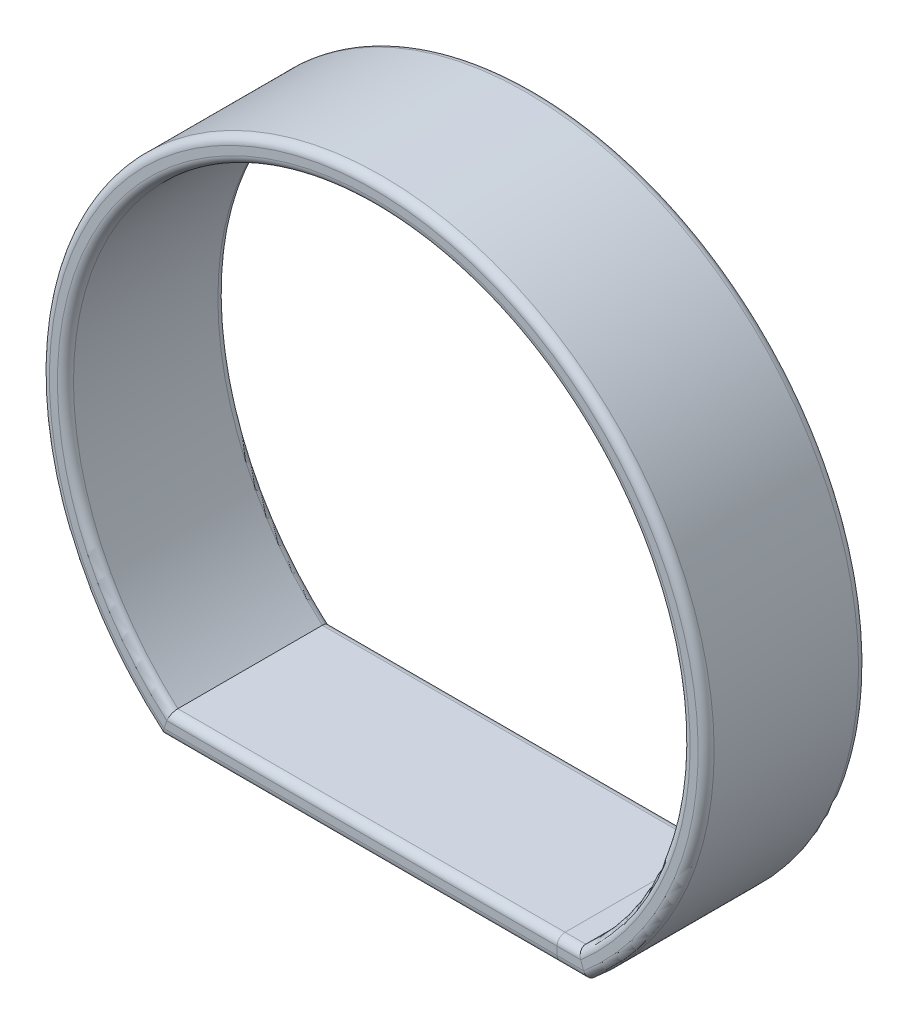
ISO-10303-21;
HEADER;
FILE_DESCRIPTION(('STEP AP214'),'2;1');
FILE_NAME('part.step','',(''),(''),'','','');
FILE_SCHEMA(('AUTOMOTIVE_DESIGN { 1 0 10303 214 1 1 1 1 }'));
ENDSEC;
DATA;
#1=APPLICATION_CONTEXT('core data for automotive mechanical design processes');
#2=APPLICATION_PROTOCOL_DEFINITION('international standard','automotive_design',2000,#1);
#3=PRODUCT_CONTEXT('',#1,'mechanical');
#4=PRODUCT('Part','Part','',(#3));
#5=PRODUCT_RELATED_PRODUCT_CATEGORY('part','',(#4));
#6=PRODUCT_DEFINITION_FORMATION('','',#4);
#7=PRODUCT_DEFINITION_CONTEXT('part definition',#1,'design');
#8=PRODUCT_DEFINITION('design','',#6,#7);
#9=PRODUCT_DEFINITION_SHAPE('','',#8);
#10=(LENGTH_UNIT() NAMED_UNIT(*) SI_UNIT(.MILLI.,.METRE.));
#11=(NAMED_UNIT(*) PLANE_ANGLE_UNIT() SI_UNIT($,.RADIAN.));
#12=(NAMED_UNIT(*) SI_UNIT($,.STERADIAN.) SOLID_ANGLE_UNIT());
#13=UNCERTAINTY_MEASURE_WITH_UNIT(LENGTH_MEASURE(1.E-05),#10,'distance_accuracy_value','');
#14=(GEOMETRIC_REPRESENTATION_CONTEXT(3) GLOBAL_UNCERTAINTY_ASSIGNED_CONTEXT((#13)) GLOBAL_UNIT_ASSIGNED_CONTEXT((#10,
#11,#12)) REPRESENTATION_CONTEXT('',''));
#15=CARTESIAN_POINT('',(0.,0.,0.));
#16=DIRECTION('',(0.,0.,1.));
#17=DIRECTION('',(1.,0.,0.));
#18=AXIS2_PLACEMENT_3D('',#15,#16,#17);
#19=CARTESIAN_POINT('',(-45.9079817895465,4.96898792112468,10.));
#20=DIRECTION('',(0.,0.,-1.));
#21=DIRECTION('',(-1.,0.,0.));
#22=AXIS2_PLACEMENT_3D('',#19,#20,#21);
#23=PLANE('',#22);
#24=CARTESIAN_POINT('',(0.,-3.42686325526142,10.));
#25=DIRECTION('',(0.,1.,0.));
#26=VECTOR('',#25,1.);
#27=LINE('',#24,#26);
#28=CARTESIAN_POINT('',(0.,-3.42686325526142,10.));
#29=VERTEX_POINT('',#28);
#30=CARTESIAN_POINT('',(0.,-2.42686325526142,10.));
#31=VERTEX_POINT('',#30);
#32=EDGE_CURVE('E198',#29,#31,#27,.T.);
#33=ORIENTED_EDGE('',*,*,#32,.T.);
#34=DIRECTION('',(1.,0.,0.));
#35=VECTOR('',#34,1.);
#36=CARTESIAN_POINT('',(-45.9079817895465,-2.42686325526143,10.));
#37=LINE('',#36,#35);
#38=CARTESIAN_POINT('',(-48.6453493144092,-2.42686325526143,10.));
#39=VERTEX_POINT('',#38);
#40=EDGE_CURVE('E162',#31,#39,#37,.F.);
#41=ORIENTED_EDGE('',*,*,#40,.T.);
#42=CARTESIAN_POINT('',(-22.8511839422926,27.3973683071413,10.));
#43=DIRECTION('',(0.,0.,1.));
#44=DIRECTION('',(1.,0.,0.));
#45=AXIS2_PLACEMENT_3D('',#42,#43,#44);
#46=CIRCLE('',#45,39.4312554041002);
#47=CARTESIAN_POINT('',(-48.6409213207164,-2.4306947995258,10.));
#48=VERTEX_POINT('',#47);
#49=EDGE_CURVE('E48',#39,#48,#46,.T.);
#50=ORIENTED_EDGE('',*,*,#49,.T.);
#51=DIRECTION('',(0.346457639778276,0.938065618088237,0.));
#52=VECTOR('',#51,1.);
#53=CARTESIAN_POINT('',(-45.9079817895465,4.96898792112468,10.));
#54=LINE('',#53,#52);
#55=CARTESIAN_POINT('',(-49.0088381970422,-3.42686325526143,10.));
#56=VERTEX_POINT('',#55);
#57=EDGE_CURVE('E501',#56,#48,#54,.T.);
#58=ORIENTED_EDGE('',*,*,#57,.F.);
#59=DIRECTION('',(1.,0.,0.));
#60=VECTOR('',#59,1.);
#61=CARTESIAN_POINT('',(-45.9079817895465,-3.42686325526143,10.));
#62=LINE('',#61,#60);
#63=EDGE_CURVE('E191',#56,#29,#62,.T.);
#64=ORIENTED_EDGE('',*,*,#63,.T.);
#65=EDGE_LOOP('',(#33,#41,#50,#58,#64));
#66=FACE_BOUND('',#65,.T.);
#67=ADVANCED_FACE('F37',(#66),#23,.F.);
#68=CARTESIAN_POINT('',(-48.2701742206685,-1.42686325526143,0.));
#69=DIRECTION('',(0.,-1.,0.));
#70=DIRECTION('',(0.,0.,-1.));
#71=AXIS2_PLACEMENT_3D('',#68,#69,#70);
#72=PLANE('',#71);
#73=DIRECTION('',(0.,0.,1.));
#74=VECTOR('',#73,1.);
#75=CARTESIAN_POINT('',(-48.2701742206685,-1.42686325526143,0.));
#76=LINE('',#75,#74);
#77=CARTESIAN_POINT('',(-48.2701742206685,-1.42686325526143,9.));
#78=VERTEX_POINT('',#77);
#79=CARTESIAN_POINT('',(-48.2701742206685,-1.42686325526143,-9.));
#80=VERTEX_POINT('',#79);
#81=EDGE_CURVE('E189',#78,#80,#76,.F.);
#82=ORIENTED_EDGE('',*,*,#81,.F.);
#83=DIRECTION('',(1.,0.,0.));
#84=VECTOR('',#83,1.);
#85=CARTESIAN_POINT('',(-48.2701742206685,-1.42686325526143,9.));
#86=LINE('',#85,#84);
#87=CARTESIAN_POINT('',(0.,-1.42686325526143,9.00000000000001));
#88=VERTEX_POINT('',#87);
#89=EDGE_CURVE('E160',#78,#88,#86,.T.);
#90=ORIENTED_EDGE('',*,*,#89,.T.);
#91=CARTESIAN_POINT('',(0.,-1.42686325526143,9.00000000000001));
#92=DIRECTION('',(0.,0.,-1.));
#93=VECTOR('',#92,1.);
#94=LINE('',#91,#93);
#95=CARTESIAN_POINT('',(0.,-1.42686325526143,-9.00000000000001));
#96=VERTEX_POINT('',#95);
#97=EDGE_CURVE('E186',#88,#96,#94,.T.);
#98=ORIENTED_EDGE('',*,*,#97,.T.);
#99=DIRECTION('',(1.,0.,0.));
#100=VECTOR('',#99,1.);
#101=CARTESIAN_POINT('',(-48.2701742206685,-1.42686325526143,-9.));
#102=LINE('',#101,#100);
#103=EDGE_CURVE('E192',#96,#80,#102,.F.);
#104=ORIENTED_EDGE('',*,*,#103,.T.);
#105=EDGE_LOOP('',(#82,#90,#98,#104));
#106=FACE_BOUND('',#105,.T.);
#107=ADVANCED_FACE('F185',(#106),#72,.F.);
#108=CARTESIAN_POINT('',(-45.9079817895465,4.96898792112468,-10.));
#109=DIRECTION('',(0.,0.,1.));
#110=DIRECTION('',(1.,0.,0.));
#111=AXIS2_PLACEMENT_3D('',#108,#109,#110);
#112=PLANE('',#111);
#113=CARTESIAN_POINT('',(0.,-2.42686325526143,-10.));
#114=DIRECTION('',(0.,-1.,0.));
#115=VECTOR('',#114,1.);
#116=LINE('',#113,#115);
#117=CARTESIAN_POINT('',(0.,-2.42686325526143,-10.));
#118=VERTEX_POINT('',#117);
#119=CARTESIAN_POINT('',(0.,-3.42686325526143,-10.));
#120=VERTEX_POINT('',#119);
#121=EDGE_CURVE('E199',#118,#120,#116,.T.);
#122=ORIENTED_EDGE('',*,*,#121,.T.);
#123=DIRECTION('',(1.,0.,0.));
#124=VECTOR('',#123,1.);
#125=CARTESIAN_POINT('',(-45.9079817895465,-3.42686325526143,-10.));
#126=LINE('',#125,#124);
#127=CARTESIAN_POINT('',(-49.0088381970422,-3.42686325526143,-10.));
#128=VERTEX_POINT('',#127);
#129=EDGE_CURVE('E473',#120,#128,#126,.F.);
#130=ORIENTED_EDGE('',*,*,#129,.T.);
#131=DIRECTION('',(-0.346457639778276,-0.938065618088237,0.));
#132=VECTOR('',#131,1.);
#133=CARTESIAN_POINT('',(-45.9079817895465,4.96898792112468,-10.));
#134=LINE('',#133,#132);
#135=CARTESIAN_POINT('',(-48.6409213207164,-2.43069479952581,-10.));
#136=VERTEX_POINT('',#135);
#137=EDGE_CURVE('E530',#136,#128,#134,.T.);
#138=ORIENTED_EDGE('',*,*,#137,.F.);
#139=CARTESIAN_POINT('',(-22.8511839422926,27.3973683071413,-10.));
#140=DIRECTION('',(0.,0.,-1.));
#141=DIRECTION('',(-1.,0.,0.));
#142=AXIS2_PLACEMENT_3D('',#139,#140,#141);
#143=CIRCLE('',#142,39.4312554041002);
#144=CARTESIAN_POINT('',(-48.6453493144092,-2.42686325526143,-10.));
#145=VERTEX_POINT('',#144);
#146=EDGE_CURVE('E556',#136,#145,#143,.T.);
#147=ORIENTED_EDGE('',*,*,#146,.T.);
#148=DIRECTION('',(1.,0.,0.));
#149=VECTOR('',#148,1.);
#150=CARTESIAN_POINT('',(-45.9079817895465,-2.42686325526143,-10.));
#151=LINE('',#150,#149);
#152=EDGE_CURVE('E533',#145,#118,#151,.T.);
#153=ORIENTED_EDGE('',*,*,#152,.T.);
#154=EDGE_LOOP('',(#122,#130,#138,#147,#153));
#155=FACE_BOUND('',#154,.T.);
#156=ADVANCED_FACE('F307',(#155),#112,.F.);
#157=CARTESIAN_POINT('',(-49.3781701852291,-4.42686325526143,0.));
#158=DIRECTION('',(0.,1.,0.));
#159=DIRECTION('',(0.,0.,1.));
#160=AXIS2_PLACEMENT_3D('',#157,#158,#159);
#161=PLANE('',#160);
#162=CARTESIAN_POINT('',(0.,-4.42686325526143,-9.));
#163=DIRECTION('',(0.,0.,1.));
#164=VECTOR('',#163,1.);
#165=LINE('',#162,#164);
#166=CARTESIAN_POINT('',(0.,-4.42686325526143,-9.));
#167=VERTEX_POINT('',#166);
#168=CARTESIAN_POINT('',(0.,-4.42686325526143,9.));
#169=VERTEX_POINT('',#168);
#170=EDGE_CURVE('E249',#167,#169,#165,.T.);
#171=ORIENTED_EDGE('',*,*,#170,.T.);
#172=DIRECTION('',(1.,0.,0.));
#173=VECTOR('',#172,1.);
#174=CARTESIAN_POINT('',(-49.3781701852291,-4.42686325526143,9.));
#175=LINE('',#174,#173);
#176=CARTESIAN_POINT('',(-49.3781701852291,-4.42686325526143,9.));
#177=VERTEX_POINT('',#176);
#178=EDGE_CURVE('E255',#169,#177,#175,.F.);
#179=ORIENTED_EDGE('',*,*,#178,.T.);
#180=DIRECTION('',(0.,0.,1.));
#181=VECTOR('',#180,1.);
#182=CARTESIAN_POINT('',(-49.3781701852291,-4.42686325526143,0.));
#183=LINE('',#182,#181);
#184=CARTESIAN_POINT('',(-49.3781701852291,-4.42686325526143,-9.));
#185=VERTEX_POINT('',#184);
#186=EDGE_CURVE('E742',#185,#177,#183,.T.);
#187=ORIENTED_EDGE('',*,*,#186,.F.);
#188=DIRECTION('',(1.,0.,0.));
#189=VECTOR('',#188,1.);
#190=CARTESIAN_POINT('',(-49.3781701852291,-4.42686325526143,-9.));
#191=LINE('',#190,#189);
#192=EDGE_CURVE('E253',#185,#167,#191,.T.);
#193=ORIENTED_EDGE('',*,*,#192,.T.);
#194=EDGE_LOOP('',(#171,#179,#187,#193));
#195=FACE_BOUND('',#194,.T.);
#196=ADVANCED_FACE('F315',(#195),#161,.F.);
#197=CARTESIAN_POINT('',(-22.8511839422926,27.3973683071413,0.));
#198=DIRECTION('',(0.,0.,1.));
#199=DIRECTION('',(1.,0.,0.));
#200=AXIS2_PLACEMENT_3D('',#197,#198,#199);
#201=CYLINDRICAL_SURFACE('',#200,38.4312554041002);
#202=ORIENTED_EDGE('',*,*,#81,.T.);
#203=CARTESIAN_POINT('',(-22.8511839422926,27.3973683071413,-9.));
#204=DIRECTION('',(0.,0.,-1.));
#205=DIRECTION('',(-1.,0.,0.));
#206=AXIS2_PLACEMENT_3D('',#203,#204,#205);
#207=CIRCLE('',#206,38.4312554041002);
#208=CARTESIAN_POINT('',(2.56780633608324,-1.42686325526142,-9.));
#209=VERTEX_POINT('',#208);
#210=EDGE_CURVE('E527',#80,#209,#207,.T.);
#211=ORIENTED_EDGE('',*,*,#210,.T.);
#212=DIRECTION('',(0.,0.,1.));
#213=VECTOR('',#212,1.);
#214=CARTESIAN_POINT('',(2.56780633608324,-1.42686325526142,10.));
#215=LINE('',#214,#213);
#216=CARTESIAN_POINT('',(2.56780633608324,-1.42686325526142,9.));
#217=VERTEX_POINT('',#216);
#218=EDGE_CURVE('E492',#209,#217,#215,.T.);
#219=ORIENTED_EDGE('',*,*,#218,.T.);
#220=CARTESIAN_POINT('',(-22.8511839422926,27.3973683071413,9.));
#221=DIRECTION('',(0.,0.,1.));
#222=DIRECTION('',(1.,0.,0.));
#223=AXIS2_PLACEMENT_3D('',#220,#221,#222);
#224=CIRCLE('',#223,38.4312554041002);
#225=EDGE_CURVE('E529',#217,#78,#224,.T.);
#226=ORIENTED_EDGE('',*,*,#225,.T.);
#227=EDGE_LOOP('',(#202,#211,#219,#226));
#228=FACE_BOUND('',#227,.T.);
#229=ADVANCED_FACE('F321',(#228),#201,.F.);
#230=CARTESIAN_POINT('',(7.48933450559821,-14.7523490700044,-10.));
#231=DIRECTION('',(0.,0.,-1.));
#232=DIRECTION('',(-1.,0.,0.));
#233=AXIS2_PLACEMENT_3D('',#230,#231,#232);
#234=PLANE('',#233);
#235=DIRECTION('',(-0.346457639778275,0.938065618088238,0.));
#236=VECTOR('',#235,1.);
#237=CARTESIAN_POINT('',(7.48933450559821,-14.7523490700044,-9.99999999999999));
#238=LINE('',#237,#236);
#239=CARTESIAN_POINT('',(3.30647031245699,-3.42686325526142,-10.));
#240=VERTEX_POINT('',#239);
#241=CARTESIAN_POINT('',(2.9385534361311,-2.43069479952579,-10.));
#242=VERTEX_POINT('',#241);
#243=EDGE_CURVE('E489',#240,#242,#238,.T.);
#244=ORIENTED_EDGE('',*,*,#243,.T.);
#245=CARTESIAN_POINT('',(-22.8511839422926,27.3973683071413,-10.));
#246=DIRECTION('',(0.,0.,-1.));
#247=DIRECTION('',(-1.,0.,0.));
#248=AXIS2_PLACEMENT_3D('',#245,#246,#247);
#249=CIRCLE('',#248,39.4312554041002);
#250=CARTESIAN_POINT('',(2.94298143043628,-2.42686325526142,-10.));
#251=VERTEX_POINT('',#250);
#252=EDGE_CURVE('E554',#251,#242,#249,.T.);
#253=ORIENTED_EDGE('',*,*,#252,.F.);
#254=CARTESIAN_POINT('',(-22.8511839422926,27.3973683071413,-10.));
#255=DIRECTION('',(0.,0.,-1.));
#256=DIRECTION('',(-1.,0.,0.));
#257=AXIS2_PLACEMENT_3D('',#254,#255,#256);
#258=CIRCLE('',#257,39.4312554041002);
#259=EDGE_CURVE('E56',#251,#145,#258,.F.);
#260=ORIENTED_EDGE('',*,*,#259,.T.);
#261=ORIENTED_EDGE('',*,*,#146,.F.);
#262=ORIENTED_EDGE('',*,*,#137,.T.);
#263=DIRECTION('',(1.,0.,0.));
#264=VECTOR('',#263,1.);
#265=CARTESIAN_POINT('',(-49.0111888574245,-3.42686325526143,-10.));
#266=LINE('',#265,#264);
#267=CARTESIAN_POINT('',(-49.0135395178065,-3.42686622417422,-10.));
#268=VERTEX_POINT('',#267);
#269=EDGE_CURVE('E572',#128,#268,#266,.F.);
#270=ORIENTED_EDGE('',*,*,#269,.T.);
#271=CARTESIAN_POINT('',(-22.8511839422926,27.3973683071413,-10.));
#272=DIRECTION('',(0.,0.,-1.));
#273=DIRECTION('',(-1.,0.,0.));
#274=AXIS2_PLACEMENT_3D('',#271,#272,#273);
#275=CIRCLE('',#274,40.4302149846024);
#276=CARTESIAN_POINT('',(3.31117163322109,-3.42686622417436,-10.));
#277=VERTEX_POINT('',#276);
#278=EDGE_CURVE('E574',#268,#277,#275,.T.);
#279=ORIENTED_EDGE('',*,*,#278,.T.);
#280=DIRECTION('',(-1.,0.,0.));
#281=VECTOR('',#280,1.);
#282=CARTESIAN_POINT('',(3.30882097283912,-3.42686325526142,-10.));
#283=LINE('',#282,#281);
#284=EDGE_CURVE('E570',#277,#240,#283,.T.);
#285=ORIENTED_EDGE('',*,*,#284,.T.);
#286=EDGE_LOOP('',(#244,#253,#260,#261,#262,#270,#279,#285));
#287=FACE_BOUND('',#286,.T.);
#288=ADVANCED_FACE('F520',(#287),#234,.T.);
#289=CARTESIAN_POINT('',(-22.8511839422926,27.3973683071413,0.));
#290=DIRECTION('',(0.,0.,1.));
#291=DIRECTION('',(1.,0.,0.));
#292=AXIS2_PLACEMENT_3D('',#289,#290,#291);
#293=CYLINDRICAL_SURFACE('',#292,41.4302149846024);
#294=DIRECTION('',(0.,0.,-1.));
#295=VECTOR('',#294,1.);
#296=CARTESIAN_POINT('',(3.67580230064386,-4.42686325526142,10.));
#297=LINE('',#296,#295);
#298=CARTESIAN_POINT('',(3.67580230064386,-4.42686325526142,9.));
#299=VERTEX_POINT('',#298);
#300=CARTESIAN_POINT('',(3.67580230064386,-4.42686325526142,-9.));
#301=VERTEX_POINT('',#300);
#302=EDGE_CURVE('E338',#299,#301,#297,.T.);
#303=ORIENTED_EDGE('',*,*,#302,.T.);
#304=CARTESIAN_POINT('',(-22.8511839422926,27.3973683071413,-9.));
#305=DIRECTION('',(0.,0.,-1.));
#306=DIRECTION('',(-1.,0.,0.));
#307=AXIS2_PLACEMENT_3D('',#304,#305,#306);
#308=CIRCLE('',#307,41.4302149846024);
#309=EDGE_CURVE('E485',#301,#185,#308,.F.);
#310=ORIENTED_EDGE('',*,*,#309,.T.);
#311=ORIENTED_EDGE('',*,*,#186,.T.);
#312=CARTESIAN_POINT('',(-22.8511839422926,27.3973683071413,9.));
#313=DIRECTION('',(0.,0.,1.));
#314=DIRECTION('',(1.,0.,0.));
#315=AXIS2_PLACEMENT_3D('',#312,#313,#314);
#316=CIRCLE('',#315,41.4302149846024);
#317=EDGE_CURVE('E488',#177,#299,#316,.F.);
#318=ORIENTED_EDGE('',*,*,#317,.T.);
#319=EDGE_LOOP('',(#303,#310,#311,#318));
#320=FACE_BOUND('',#319,.T.);
#321=ADVANCED_FACE('F483',(#320),#293,.T.);
#322=CARTESIAN_POINT('',(7.48933450559821,-14.7523490700044,10.));
#323=DIRECTION('',(0.,0.,1.));
#324=DIRECTION('',(1.,0.,0.));
#325=AXIS2_PLACEMENT_3D('',#322,#323,#324);
#326=PLANE('',#325);
#327=CARTESIAN_POINT('',(-22.8511839422926,27.3973683071413,10.));
#328=DIRECTION('',(0.,0.,1.));
#329=DIRECTION('',(1.,0.,0.));
#330=AXIS2_PLACEMENT_3D('',#327,#328,#329);
#331=CIRCLE('',#330,40.4302149846024);
#332=CARTESIAN_POINT('',(3.31117163322132,-3.42686622417416,10.));
#333=VERTEX_POINT('',#332);
#334=CARTESIAN_POINT('',(-49.0135395178065,-3.42686622417426,10.));
#335=VERTEX_POINT('',#334);
#336=EDGE_CURVE('E264',#333,#335,#331,.T.);
#337=ORIENTED_EDGE('',*,*,#336,.T.);
#338=DIRECTION('',(1.,0.,0.));
#339=VECTOR('',#338,1.);
#340=CARTESIAN_POINT('',(-49.0111888574244,-3.42686325526143,10.));
#341=LINE('',#340,#339);
#342=EDGE_CURVE('E268',#335,#56,#341,.T.);
#343=ORIENTED_EDGE('',*,*,#342,.T.);
#344=ORIENTED_EDGE('',*,*,#57,.T.);
#345=ORIENTED_EDGE('',*,*,#49,.F.);
#346=CARTESIAN_POINT('',(-22.8511839422926,27.3973683071413,10.));
#347=DIRECTION('',(0.,0.,1.));
#348=DIRECTION('',(1.,0.,0.));
#349=AXIS2_PLACEMENT_3D('',#346,#347,#348);
#350=CIRCLE('',#349,39.4312554041002);
#351=CARTESIAN_POINT('',(2.94298143043628,-2.42686325526142,10.));
#352=VERTEX_POINT('',#351);
#353=EDGE_CURVE('E260',#39,#352,#350,.F.);
#354=ORIENTED_EDGE('',*,*,#353,.T.);
#355=CARTESIAN_POINT('',(-22.8511839422926,27.3973683071413,10.));
#356=DIRECTION('',(0.,0.,1.));
#357=DIRECTION('',(1.,0.,0.));
#358=AXIS2_PLACEMENT_3D('',#355,#356,#357);
#359=CIRCLE('',#358,39.4312554041002);
#360=CARTESIAN_POINT('',(2.9385534361311,-2.43069479952579,10.));
#361=VERTEX_POINT('',#360);
#362=EDGE_CURVE('E12',#361,#352,#359,.T.);
#363=ORIENTED_EDGE('',*,*,#362,.F.);
#364=DIRECTION('',(0.346457639778275,-0.938065618088238,0.));
#365=VECTOR('',#364,1.);
#366=CARTESIAN_POINT('',(7.48933450559821,-14.7523490700044,9.99999999999999));
#367=LINE('',#366,#365);
#368=CARTESIAN_POINT('',(3.30647031245699,-3.42686325526142,10.));
#369=VERTEX_POINT('',#368);
#370=EDGE_CURVE('E498',#361,#369,#367,.T.);
#371=ORIENTED_EDGE('',*,*,#370,.T.);
#372=DIRECTION('',(-1.,0.,0.));
#373=VECTOR('',#372,1.);
#374=CARTESIAN_POINT('',(3.30882097283924,-3.42686325526142,10.));
#375=LINE('',#374,#373);
#376=EDGE_CURVE('E266',#369,#333,#375,.F.);
#377=ORIENTED_EDGE('',*,*,#376,.T.);
#378=EDGE_LOOP('',(#337,#343,#344,#345,#354,#363,#371,#377));
#379=FACE_BOUND('',#378,.T.);
#380=ADVANCED_FACE('F220',(#379),#326,.T.);
#381=CARTESIAN_POINT('',(43.5693011506769,-1.42686325526142,10.));
#382=DIRECTION('',(0.,-1.,0.));
#383=DIRECTION('',(0.,0.,-1.));
#384=AXIS2_PLACEMENT_3D('',#381,#382,#383);
#385=PLANE('',#384);
#386=ORIENTED_EDGE('',*,*,#97,.F.);
#387=DIRECTION('',(-1.,0.,0.));
#388=VECTOR('',#387,1.);
#389=CARTESIAN_POINT('',(43.5693011506769,-1.42686325526142,9.));
#390=LINE('',#389,#388);
#391=EDGE_CURVE('E171',#88,#217,#390,.F.);
#392=ORIENTED_EDGE('',*,*,#391,.T.);
#393=ORIENTED_EDGE('',*,*,#218,.F.);
#394=DIRECTION('',(-1.,0.,0.));
#395=VECTOR('',#394,1.);
#396=CARTESIAN_POINT('',(43.5693011506769,-1.42686325526142,-9.));
#397=LINE('',#396,#395);
#398=EDGE_CURVE('E180',#209,#96,#397,.T.);
#399=ORIENTED_EDGE('',*,*,#398,.T.);
#400=EDGE_LOOP('',(#386,#392,#393,#399));
#401=FACE_BOUND('',#400,.T.);
#402=ADVANCED_FACE('F196',(#401),#385,.F.);
#403=CARTESIAN_POINT('',(43.5693011506769,-1.42686325526142,-10.));
#404=DIRECTION('',(0.,0.,1.));
#405=DIRECTION('',(0.,-1.,0.));
#406=AXIS2_PLACEMENT_3D('',#403,#404,#405);
#407=PLANE('',#406);
#408=ORIENTED_EDGE('',*,*,#121,.F.);
#409=DIRECTION('',(-1.,0.,0.));
#410=VECTOR('',#409,1.);
#411=CARTESIAN_POINT('',(43.5693011506769,-2.42686325526142,-10.));
#412=LINE('',#411,#410);
#413=EDGE_CURVE('E576',#118,#251,#412,.F.);
#414=ORIENTED_EDGE('',*,*,#413,.T.);
#415=ORIENTED_EDGE('',*,*,#252,.T.);
#416=ORIENTED_EDGE('',*,*,#243,.F.);
#417=DIRECTION('',(-1.,0.,0.));
#418=VECTOR('',#417,1.);
#419=CARTESIAN_POINT('',(43.5693011506769,-3.42686325526142,-10.));
#420=LINE('',#419,#418);
#421=EDGE_CURVE('E179',#240,#120,#420,.T.);
#422=ORIENTED_EDGE('',*,*,#421,.T.);
#423=EDGE_LOOP('',(#408,#414,#415,#416,#422));
#424=FACE_BOUND('',#423,.T.);
#425=ADVANCED_FACE('F219',(#424),#407,.F.);
#426=CARTESIAN_POINT('',(43.5693011506769,-4.42686325526142,10.));
#427=DIRECTION('',(0.,1.,0.));
#428=DIRECTION('',(0.,0.,1.));
#429=AXIS2_PLACEMENT_3D('',#426,#427,#428);
#430=PLANE('',#429);
#431=ORIENTED_EDGE('',*,*,#302,.F.);
#432=DIRECTION('',(-1.,0.,0.));
#433=VECTOR('',#432,1.);
#434=CARTESIAN_POINT('',(43.5693011506769,-4.42686325526142,9.));
#435=LINE('',#434,#433);
#436=EDGE_CURVE('E272',#299,#169,#435,.T.);
#437=ORIENTED_EDGE('',*,*,#436,.T.);
#438=ORIENTED_EDGE('',*,*,#170,.F.);
#439=DIRECTION('',(-1.,0.,0.));
#440=VECTOR('',#439,1.);
#441=CARTESIAN_POINT('',(43.5693011506769,-4.42686325526142,-9.));
#442=LINE('',#441,#440);
#443=EDGE_CURVE('E270',#167,#301,#442,.F.);
#444=ORIENTED_EDGE('',*,*,#443,.T.);
#445=EDGE_LOOP('',(#431,#437,#438,#444));
#446=FACE_BOUND('',#445,.T.);
#447=ADVANCED_FACE('F224',(#446),#430,.F.);
#448=CARTESIAN_POINT('',(43.5693011506769,-1.42686325526142,10.));
#449=DIRECTION('',(0.,0.,-1.));
#450=DIRECTION('',(0.,1.,0.));
#451=AXIS2_PLACEMENT_3D('',#448,#449,#450);
#452=PLANE('',#451);
#453=ORIENTED_EDGE('',*,*,#32,.F.);
#454=DIRECTION('',(-1.,0.,0.));
#455=VECTOR('',#454,1.);
#456=CARTESIAN_POINT('',(43.5693011506769,-3.42686325526142,10.));
#457=LINE('',#456,#455);
#458=EDGE_CURVE('E280',#29,#369,#457,.F.);
#459=ORIENTED_EDGE('',*,*,#458,.T.);
#460=ORIENTED_EDGE('',*,*,#370,.F.);
#461=ORIENTED_EDGE('',*,*,#362,.T.);
#462=DIRECTION('',(-1.,0.,0.));
#463=VECTOR('',#462,1.);
#464=CARTESIAN_POINT('',(43.5693011506769,-2.42686325526142,10.));
#465=LINE('',#464,#463);
#466=EDGE_CURVE('E276',#352,#31,#465,.T.);
#467=ORIENTED_EDGE('',*,*,#466,.T.);
#468=EDGE_LOOP('',(#453,#459,#460,#461,#467));
#469=FACE_BOUND('',#468,.T.);
#470=ADVANCED_FACE('F229',(#469),#452,.F.);
#471=CARTESIAN_POINT('',(-22.8511839422926,27.3973683071413,9.));
#472=DIRECTION('',(0.,0.,1.));
#473=DIRECTION('',(1.,0.,0.));
#474=AXIS2_PLACEMENT_3D('',#471,#472,#473);
#475=TOROIDAL_SURFACE('',#474,39.4312554041002,1.);
#476=CARTESIAN_POINT('',(-48.2701742206685,-1.42686325526143,9.));
#477=CARTESIAN_POINT('',(-48.2701739173758,-1.42686253800997,9.02682862178573));
#478=CARTESIAN_POINT('',(-48.2705825619027,-1.42794366676088,9.05364388737626));
#479=CARTESIAN_POINT('',(-48.27221032696,-1.43225070339111,9.10707202716864));
#480=CARTESIAN_POINT('',(-48.2734293007297,-1.4354762228947,9.13368493713701));
#481=CARTESIAN_POINT('',(-48.2782799604569,-1.44831287713093,9.21279430374575));
#482=CARTESIAN_POINT('',(-48.2831054991703,-1.46108440108715,9.26474333784872));
#483=CARTESIAN_POINT('',(-48.2957501977199,-1.49456610513104,9.36557997627024));
#484=CARTESIAN_POINT('',(-48.3035688570063,-1.51527495783332,9.41446809088686));
#485=CARTESIAN_POINT('',(-48.3219106063165,-1.5638862425749,9.50798405433679));
#486=CARTESIAN_POINT('',(-48.3324344930819,-1.59179079389373,9.5526106427489));
#487=CARTESIAN_POINT('',(-48.3561458953073,-1.65471079886666,9.63769608421746));
#488=CARTESIAN_POINT('',(-48.3693978143073,-1.68989832564939,9.67800938084915));
#489=CARTESIAN_POINT('',(-48.3979544927879,-1.76579314727337,9.75219970690118));
#490=CARTESIAN_POINT('',(-48.4132599335948,-1.80650227414401,9.78607459110414));
#491=CARTESIAN_POINT('',(-48.4464716867067,-1.89492683685077,9.84861836314249));
#492=CARTESIAN_POINT('',(-48.4644798111589,-1.94291848624637,9.87684222448442));
#493=CARTESIAN_POINT('',(-48.5018016133534,-2.04249472187997,9.92483255435929));
#494=CARTESIAN_POINT('',(-48.5211155193585,-2.09407993635452,9.94459753975289));
#495=CARTESIAN_POINT('',(-48.5574348374195,-2.19119941507886,9.97293754776581));
#496=CARTESIAN_POINT('',(-48.5743270449688,-2.23641331730372,9.98278163572482));
#497=CARTESIAN_POINT('',(-48.6083630414467,-2.32760630779451,9.9961246130412));
#498=CARTESIAN_POINT('',(-48.6255062658728,-2.37358370329894,9.99963603021446));
#499=CARTESIAN_POINT('',(-48.6435326450318,-2.42197809523152,9.99999107153314));
#500=CARTESIAN_POINT('',(-48.6444424569622,-2.42442074553162,10.0000000223422));
#501=CARTESIAN_POINT('',(-48.6453521679897,-2.42686325526143,10.0000000000017));
#502=B_SPLINE_CURVE_WITH_KNOTS('',3,(#476,#477,#478,#479,#480,#481,#482,#483,#484,#485,#486,
#487,#488,#489,#490,#491,#492,#493,#494,#495,#496,#497,#498,#499,#500,#501),.UNSPECIFIED.,.F.,
.F.,(4,2,2,2,2,2,2,2,2,2,2,2,4),(0.,0.0804347163741683,0.160854868992605,0.321156531511664,
0.481431397949241,0.641753522614392,0.806416398470785,0.971134042609923,1.14592435919067,
1.32074531013614,1.46813941652315,1.61524161443763,1.62306135048608),.UNSPECIFIED.);
#503=EDGE_CURVE('E166',#78,#39,#502,.T.);
#504=ORIENTED_EDGE('',*,*,#503,.F.);
#505=ORIENTED_EDGE('',*,*,#225,.F.);
#506=CARTESIAN_POINT('',(2.56780633608324,-1.42686325526142,9.));
#507=CARTESIAN_POINT('',(2.56780603279053,-1.42686253800996,9.02682862178573));
#508=CARTESIAN_POINT('',(2.56821467731741,-1.42794366676088,9.05364388737626));
#509=CARTESIAN_POINT('',(2.56984244237469,-1.4322507033911,9.10707202716864));
#510=CARTESIAN_POINT('',(2.57106141614445,-1.4354762228947,9.13368493713701));
#511=CARTESIAN_POINT('',(2.57591207587165,-1.44831287713092,9.21279430374575));
#512=CARTESIAN_POINT('',(2.58073761458509,-1.46108440108714,9.26474333784872));
#513=CARTESIAN_POINT('',(2.59338231313459,-1.49456610513103,9.36557997627024));
#514=CARTESIAN_POINT('',(2.60120097242109,-1.51527495783331,9.41446809088686));
#515=CARTESIAN_POINT('',(2.6195427217313,-1.56388624257489,9.50798405433678));
#516=CARTESIAN_POINT('',(2.63006660849662,-1.59179079389372,9.5526106427489));
#517=CARTESIAN_POINT('',(2.653778010722,-1.65471079886665,9.63769608421746));
#518=CARTESIAN_POINT('',(2.667029929722,-1.68989832564938,9.67800938084915));
#519=CARTESIAN_POINT('',(2.69558660820266,-1.76579314727335,9.75219970690118));
#520=CARTESIAN_POINT('',(2.71089204900959,-1.80650227414399,9.78607459110414));
#521=CARTESIAN_POINT('',(2.74410380212147,-1.89492683685075,9.84861836314249));
#522=CARTESIAN_POINT('',(2.7621119265736,-1.94291848624637,9.87684222448442));
#523=CARTESIAN_POINT('',(2.79943372876824,-2.04249472187993,9.92483255435928));
#524=CARTESIAN_POINT('',(2.81874763477345,-2.09407993635443,9.94459753975289));
#525=CARTESIAN_POINT('',(2.85506695283409,-2.19119941507892,9.97293754776581));
#526=CARTESIAN_POINT('',(2.87195916038293,-2.23641331730395,9.98278163572482));
#527=CARTESIAN_POINT('',(2.90599515686212,-2.32760630779426,9.9961246130412));
#528=CARTESIAN_POINT('',(2.92313838128988,-2.37358370329807,9.99963603021447));
#529=CARTESIAN_POINT('',(2.94116476044682,-2.42197809523143,9.99999107153315));
#530=CARTESIAN_POINT('',(2.94207457237709,-2.42442074553156,10.0000000223422));
#531=CARTESIAN_POINT('',(2.94298428340447,-2.42686325526142,10.0000000000017));
#532=B_SPLINE_CURVE_WITH_KNOTS('',3,(#506,#507,#508,#509,#510,#511,#512,#513,#514,#515,#516,
#517,#518,#519,#520,#521,#522,#523,#524,#525,#526,#527,#528,#529,#530,#531),.UNSPECIFIED.,.F.,
.F.,(4,2,2,2,2,2,2,2,2,2,2,2,4),(0.,0.0804347163741664,0.160854868992607,0.321156531511661,
0.481431397949235,0.641753522614391,0.806416398470779,0.971134042609917,1.14592435919067,
1.32074531013613,1.46813941652316,1.61524161443763,1.62306135048608),.UNSPECIFIED.);
#533=EDGE_CURVE('E174',#352,#217,#532,.F.);
#534=ORIENTED_EDGE('',*,*,#533,.F.);
#535=ORIENTED_EDGE('',*,*,#353,.F.);
#536=EDGE_LOOP('',(#504,#505,#534,#535));
#537=FACE_BOUND('',#536,.T.);
#538=ADVANCED_FACE('F323',(#537),#475,.T.);
#539=CARTESIAN_POINT('',(43.5693011506769,-2.42686325526142,9.));
#540=DIRECTION('',(-1.,0.,0.));
#541=DIRECTION('',(0.,0.,1.));
#542=AXIS2_PLACEMENT_3D('',#539,#540,#541);
#543=CYLINDRICAL_SURFACE('',#542,1.);
#544=ORIENTED_EDGE('',*,*,#533,.T.);
#545=ORIENTED_EDGE('',*,*,#391,.F.);
#546=CARTESIAN_POINT('',(0.,-2.42686325526143,9.));
#547=DIRECTION('',(-1.,0.,0.));
#548=DIRECTION('',(0.,0.,1.));
#549=AXIS2_PLACEMENT_3D('',#546,#547,#548);
#550=CIRCLE('',#549,0.999999999999999);
#551=EDGE_CURVE('E154',#31,#88,#550,.T.);
#552=ORIENTED_EDGE('',*,*,#551,.F.);
#553=ORIENTED_EDGE('',*,*,#466,.F.);
#554=EDGE_LOOP('',(#544,#545,#552,#553));
#555=FACE_BOUND('',#554,.T.);
#556=ADVANCED_FACE('F172',(#555),#543,.T.);
#557=CARTESIAN_POINT('',(-48.2701742206685,-2.42686325526143,9.));
#558=DIRECTION('',(1.,0.,0.));
#559=DIRECTION('',(0.,0.,-1.));
#560=AXIS2_PLACEMENT_3D('',#557,#558,#559);
#561=CYLINDRICAL_SURFACE('',#560,1.);
#562=ORIENTED_EDGE('',*,*,#503,.T.);
#563=ORIENTED_EDGE('',*,*,#40,.F.);
#564=ORIENTED_EDGE('',*,*,#551,.T.);
#565=ORIENTED_EDGE('',*,*,#89,.F.);
#566=EDGE_LOOP('',(#562,#563,#564,#565));
#567=FACE_BOUND('',#566,.T.);
#568=ADVANCED_FACE('F158',(#567),#561,.T.);
#569=CARTESIAN_POINT('',(-22.8511839422926,27.3973683071413,9.));
#570=DIRECTION('',(0.,0.,1.));
#571=DIRECTION('',(1.,0.,0.));
#572=AXIS2_PLACEMENT_3D('',#569,#570,#571);
#573=TOROIDAL_SURFACE('',#572,40.4302149846024,1.);
#574=CARTESIAN_POINT('',(-49.3781701852291,-4.42686325526143,9.));
#575=CARTESIAN_POINT('',(-49.378170392396,-4.42686390650587,9.02691622583868));
#576=CARTESIAN_POINT('',(-49.3777763905373,-4.42577578051729,9.05381910497527));
#577=CARTESIAN_POINT('',(-49.3762063960128,-4.42144039122406,9.10742285758609));
#578=CARTESIAN_POINT('',(-49.3750305347273,-4.41819349067083,9.13412376423669));
#579=CARTESIAN_POINT('',(-49.370349599199,-4.40526930092768,9.21350466218981));
#580=CARTESIAN_POINT('',(-49.3656910774215,-4.39240825091078,9.26563711543011));
#581=CARTESIAN_POINT('',(-49.3534683389468,-4.3586787891384,9.36683661525762));
#582=CARTESIAN_POINT('',(-49.3459044277571,-4.3378112192844,9.41590398351404));
#583=CARTESIAN_POINT('',(-49.3281328726365,-4.28881111407023,9.50975275706234));
#584=CARTESIAN_POINT('',(-49.3179245788165,-4.26067679282244,9.55453310505643));
#585=CARTESIAN_POINT('',(-49.2949106000844,-4.19729514943125,9.63978608187546));
#586=CARTESIAN_POINT('',(-49.2820468763238,-4.16188899639836,9.68012464319015));
#587=CARTESIAN_POINT('',(-49.2542779016136,-4.08552282204292,9.75432342609174));
#588=CARTESIAN_POINT('',(-49.2393719786003,-4.04456097245062,9.78818150619942));
#589=CARTESIAN_POINT('',(-49.2070381232312,-3.95579096846971,9.85049451285577));
#590=CARTESIAN_POINT('',(-49.1895151143096,-3.9077263176603,9.8785342357192));
#591=CARTESIAN_POINT('',(-49.1531322722504,-3.80803834753184,9.9261513933404));
#592=CARTESIAN_POINT('',(-49.1342722587847,-3.75641454819987,9.94572768405875));
#593=CARTESIAN_POINT('',(-49.0989272035462,-3.6597772031342,9.97357297568458));
#594=CARTESIAN_POINT('',(-49.0825697926534,-3.6150947785625,9.98318221315599));
#595=CARTESIAN_POINT('',(-49.0495597741586,-3.52501003426334,9.9962084728718));
#596=CARTESIAN_POINT('',(-49.0329078056809,-3.47960929145366,9.99963755553831));
#597=CARTESIAN_POINT('',(-49.0153495097319,-3.43178345523182,9.99999094301803));
#598=CARTESIAN_POINT('',(-49.0144462545107,-3.42932326858596,10.0000000226085));
#599=CARTESIAN_POINT('',(-49.0135430157505,-3.42686325526143,10.));
#600=B_SPLINE_CURVE_WITH_KNOTS('',3,(#574,#575,#576,#577,#578,#579,#580,#581,#582,#583,#584,
#585,#586,#587,#588,#589,#590,#591,#592,#593,#594,#595,#596,#597,#598,#599),.UNSPECIFIED.,.F.,
.F.,(4,2,2,2,2,2,2,2,2,2,2,2,4),(0.,0.0806975382301785,0.161381519810389,0.322233486421617,
0.483068543762104,0.643943165838203,0.808799945184202,0.973711107860214,1.14797264202254,
1.32225772452504,1.46751445164263,1.61248740558162,1.62034966149726),.UNSPECIFIED.);
#601=EDGE_CURVE('E350',#335,#177,#600,.F.);
#602=ORIENTED_EDGE('',*,*,#601,.F.);
#603=ORIENTED_EDGE('',*,*,#336,.F.);
#604=CARTESIAN_POINT('',(3.67580230064386,-4.42686325526142,9.));
#605=CARTESIAN_POINT('',(3.67580250781075,-4.42686390650586,9.02691622583868));
#606=CARTESIAN_POINT('',(3.67540850595207,-4.42577578051728,9.05381910497527));
#607=CARTESIAN_POINT('',(3.67383851142751,-4.42144039122404,9.10742285758609));
#608=CARTESIAN_POINT('',(3.672662650142,-4.41819349067082,9.13412376423669));
#609=CARTESIAN_POINT('',(3.66798171461372,-4.40526930092767,9.21350466218981));
#610=CARTESIAN_POINT('',(3.66332319283621,-4.39240825091077,9.26563711543011));
#611=CARTESIAN_POINT('',(3.65110045436159,-4.35867878913839,9.36683661525762));
#612=CARTESIAN_POINT('',(3.64353654317188,-4.33781121928438,9.41590398351404));
#613=CARTESIAN_POINT('',(3.6257649880513,-4.28881111407022,9.50975275706234));
#614=CARTESIAN_POINT('',(3.61555669423122,-4.26067679282243,9.55453310505644));
#615=CARTESIAN_POINT('',(3.59254271549912,-4.19729514943124,9.63978608187546));
#616=CARTESIAN_POINT('',(3.57967899173854,-4.16188899639835,9.68012464319015));
#617=CARTESIAN_POINT('',(3.5519100170284,-4.08552282204291,9.75432342609174));
#618=CARTESIAN_POINT('',(3.53700409401505,-4.04456097245061,9.78818150619942));
#619=CARTESIAN_POINT('',(3.50467023864593,-3.9557909684697,9.85049451285577));
#620=CARTESIAN_POINT('',(3.48714722972441,-3.90772631766029,9.8785342357192));
#621=CARTESIAN_POINT('',(3.45076438766516,-3.80803834753183,9.9261513933404));
#622=CARTESIAN_POINT('',(3.43190437419944,-3.75641454819986,9.94572768405875));
#623=CARTESIAN_POINT('',(3.39655931896095,-3.65977720313419,9.97357297568458));
#624=CARTESIAN_POINT('',(3.3802019080682,-3.61509477856248,9.98318221315599));
#625=CARTESIAN_POINT('',(3.34719188957334,-3.52501003426333,9.9962084728718));
#626=CARTESIAN_POINT('',(3.33053992109554,-3.47960929145368,9.99963755553831));
#627=CARTESIAN_POINT('',(3.31298162514665,-3.43178345523181,9.99999094301803));
#628=CARTESIAN_POINT('',(3.31207836992543,-3.42932326858595,10.0000000226085));
#629=CARTESIAN_POINT('',(3.31117513116522,-3.42686325526142,10.));
#630=B_SPLINE_CURVE_WITH_KNOTS('',3,(#604,#605,#606,#607,#608,#609,#610,#611,#612,#613,#614,
#615,#616,#617,#618,#619,#620,#621,#622,#623,#624,#625,#626,#627,#628,#629),.UNSPECIFIED.,.F.,
.F.,(4,2,2,2,2,2,2,2,2,2,2,2,4),(0.,0.0806975382301787,0.161381519810387,0.322233486421618,
0.483068543762103,0.643943165838204,0.808799945184201,0.973711107860215,1.14797264202254,
1.32225772452504,1.46751445164264,1.61248740558162,1.62034966149726),.UNSPECIFIED.);
#631=EDGE_CURVE('E167',#299,#333,#630,.T.);
#632=ORIENTED_EDGE('',*,*,#631,.F.);
#633=ORIENTED_EDGE('',*,*,#317,.F.);
#634=EDGE_LOOP('',(#602,#603,#632,#633));
#635=FACE_BOUND('',#634,.T.);
#636=ADVANCED_FACE('F342',(#635),#573,.T.);
#637=CARTESIAN_POINT('',(43.5693011506769,-3.42686325526142,9.));
#638=DIRECTION('',(-1.,0.,0.));
#639=DIRECTION('',(0.,0.,1.));
#640=AXIS2_PLACEMENT_3D('',#637,#638,#639);
#641=CYLINDRICAL_SURFACE('',#640,1.);
#642=ORIENTED_EDGE('',*,*,#376,.F.);
#643=ORIENTED_EDGE('',*,*,#458,.F.);
#644=CARTESIAN_POINT('',(0.,-3.42686325526143,9.));
#645=DIRECTION('',(-1.,0.,0.));
#646=DIRECTION('',(0.,-1.,0.));
#647=AXIS2_PLACEMENT_3D('',#644,#645,#646);
#648=CIRCLE('',#647,1.);
#649=EDGE_CURVE('E360',#169,#29,#648,.T.);
#650=ORIENTED_EDGE('',*,*,#649,.F.);
#651=ORIENTED_EDGE('',*,*,#436,.F.);
#652=ORIENTED_EDGE('',*,*,#631,.T.);
#653=EDGE_LOOP('',(#642,#643,#650,#651,#652));
#654=FACE_BOUND('',#653,.T.);
#655=ADVANCED_FACE('F370',(#654),#641,.T.);
#656=CARTESIAN_POINT('',(-45.9079817895465,-3.42686325526143,9.));
#657=DIRECTION('',(1.,0.,0.));
#658=DIRECTION('',(0.,0.,-1.));
#659=AXIS2_PLACEMENT_3D('',#656,#657,#658);
#660=CYLINDRICAL_SURFACE('',#659,1.);
#661=ORIENTED_EDGE('',*,*,#601,.T.);
#662=ORIENTED_EDGE('',*,*,#178,.F.);
#663=ORIENTED_EDGE('',*,*,#649,.T.);
#664=ORIENTED_EDGE('',*,*,#63,.F.);
#665=ORIENTED_EDGE('',*,*,#342,.F.);
#666=EDGE_LOOP('',(#661,#662,#663,#664,#665));
#667=FACE_BOUND('',#666,.T.);
#668=ADVANCED_FACE('F366',(#667),#660,.T.);
#669=CARTESIAN_POINT('',(-22.8511839422926,27.3973683071413,-9.));
#670=DIRECTION('',(0.,0.,-1.));
#671=DIRECTION('',(-1.,0.,0.));
#672=AXIS2_PLACEMENT_3D('',#669,#670,#671);
#673=TOROIDAL_SURFACE('',#672,39.4312554041002,1.);
#674=CARTESIAN_POINT('',(2.56780633608324,-1.42686325526142,-9.));
#675=CARTESIAN_POINT('',(2.56780603279054,-1.42686253800996,-9.02682862178573));
#676=CARTESIAN_POINT('',(2.56821467731741,-1.42794366676088,-9.05364388737626));
#677=CARTESIAN_POINT('',(2.56984244237469,-1.4322507033911,-9.10707202716865));
#678=CARTESIAN_POINT('',(2.57106141614444,-1.4354762228947,-9.13368493713701));
#679=CARTESIAN_POINT('',(2.57591207587164,-1.44831287713092,-9.21279430374575));
#680=CARTESIAN_POINT('',(2.58073761458508,-1.46108440108714,-9.26474333784872));
#681=CARTESIAN_POINT('',(2.59338231313459,-1.49456610513103,-9.36557997627024));
#682=CARTESIAN_POINT('',(2.60120097242108,-1.51527495783331,-9.41446809088686));
#683=CARTESIAN_POINT('',(2.6195427217313,-1.56388624257489,-9.50798405433679));
#684=CARTESIAN_POINT('',(2.63006660849662,-1.59179079389371,-9.5526106427489));
#685=CARTESIAN_POINT('',(2.653778010722,-1.65471079886665,-9.63769608421746));
#686=CARTESIAN_POINT('',(2.667029929722,-1.68989832564938,-9.67800938084915));
#687=CARTESIAN_POINT('',(2.69558660820266,-1.76579314727336,-9.75219970690118));
#688=CARTESIAN_POINT('',(2.71089204900961,-1.80650227414399,-9.78607459110414));
#689=CARTESIAN_POINT('',(2.74410380212146,-1.89492683685076,-9.84861836314249));
#690=CARTESIAN_POINT('',(2.76211192657355,-1.94291848624639,-9.87684222448442));
#691=CARTESIAN_POINT('',(2.7994337287683,-2.04249472187991,-9.92483255435928));
#692=CARTESIAN_POINT('',(2.81874763477365,-2.09407993635435,-9.94459753975289));
#693=CARTESIAN_POINT('',(2.85506695283394,-2.19119941507897,-9.97293754776581));
#694=CARTESIAN_POINT('',(2.87195916038239,-2.23641331730415,-9.98278163572482));
#695=CARTESIAN_POINT('',(2.90599515686269,-2.32760630779405,-9.9961246130412));
#696=CARTESIAN_POINT('',(2.92313838129196,-2.37358370329729,-9.99963603021447));
#697=CARTESIAN_POINT('',(2.94116476044704,-2.42197809523135,-9.99999107153315));
#698=CARTESIAN_POINT('',(2.9420745723772,-2.42442074553152,-10.0000000223422));
#699=CARTESIAN_POINT('',(2.94298428340447,-2.42686325526142,-10.0000000000017));
#700=B_SPLINE_CURVE_WITH_KNOTS('',3,(#674,#675,#676,#677,#678,#679,#680,#681,#682,#683,#684,
#685,#686,#687,#688,#689,#690,#691,#692,#693,#694,#695,#696,#697,#698,#699),.UNSPECIFIED.,.F.,
.F.,(4,2,2,2,2,2,2,2,2,2,2,2,4),(0.,0.0804347163741682,0.160854868992605,0.321156531511661,
0.481431397949236,0.64175352261439,0.806416398470782,0.971134042609921,1.14592435919067,
1.32074531013613,1.46813941652316,1.61524161443763,1.62306135048608),.UNSPECIFIED.);
#701=EDGE_CURVE('E392',#209,#251,#700,.T.);
#702=ORIENTED_EDGE('',*,*,#701,.F.);
#703=ORIENTED_EDGE('',*,*,#210,.F.);
#704=CARTESIAN_POINT('',(-48.2701742206685,-1.42686325526143,-9.));
#705=CARTESIAN_POINT('',(-48.2701739173758,-1.42686253800997,-9.02682862178573));
#706=CARTESIAN_POINT('',(-48.2705825619027,-1.42794366676088,-9.05364388737626));
#707=CARTESIAN_POINT('',(-48.27221032696,-1.43225070339111,-9.10707202716864));
#708=CARTESIAN_POINT('',(-48.2734293007297,-1.4354762228947,-9.13368493713701));
#709=CARTESIAN_POINT('',(-48.2782799604569,-1.44831287713093,-9.21279430374575));
#710=CARTESIAN_POINT('',(-48.2831054991703,-1.46108440108715,-9.26474333784872));
#711=CARTESIAN_POINT('',(-48.2957501977199,-1.49456610513104,-9.36557997627024));
#712=CARTESIAN_POINT('',(-48.3035688570063,-1.51527495783332,-9.41446809088686));
#713=CARTESIAN_POINT('',(-48.3219106063165,-1.5638862425749,-9.50798405433679));
#714=CARTESIAN_POINT('',(-48.3324344930819,-1.59179079389373,-9.5526106427489));
#715=CARTESIAN_POINT('',(-48.3561458953073,-1.65471079886666,-9.63769608421746));
#716=CARTESIAN_POINT('',(-48.3693978143073,-1.68989832564939,-9.67800938084915));
#717=CARTESIAN_POINT('',(-48.3979544927879,-1.76579314727337,-9.75219970690118));
#718=CARTESIAN_POINT('',(-48.4132599335948,-1.80650227414401,-9.78607459110414));
#719=CARTESIAN_POINT('',(-48.4464716867067,-1.89492683685077,-9.84861836314249));
#720=CARTESIAN_POINT('',(-48.4644798111589,-1.94291848624637,-9.87684222448442));
#721=CARTESIAN_POINT('',(-48.5018016133534,-2.04249472187997,-9.92483255435929));
#722=CARTESIAN_POINT('',(-48.5211155193585,-2.09407993635452,-9.94459753975289));
#723=CARTESIAN_POINT('',(-48.5574348374195,-2.19119941507886,-9.97293754776581));
#724=CARTESIAN_POINT('',(-48.5743270449688,-2.23641331730372,-9.98278163572482));
#725=CARTESIAN_POINT('',(-48.6083630414467,-2.32760630779451,-9.9961246130412));
#726=CARTESIAN_POINT('',(-48.6255062658728,-2.37358370329894,-9.99963603021446));
#727=CARTESIAN_POINT('',(-48.6435326450318,-2.42197809523152,-9.99999107153314));
#728=CARTESIAN_POINT('',(-48.6444424569622,-2.42442074553162,-10.0000000223422));
#729=CARTESIAN_POINT('',(-48.6453521679897,-2.42686325526143,-10.0000000000017));
#730=B_SPLINE_CURVE_WITH_KNOTS('',3,(#704,#705,#706,#707,#708,#709,#710,#711,#712,#713,#714,
#715,#716,#717,#718,#719,#720,#721,#722,#723,#724,#725,#726,#727,#728,#729),.UNSPECIFIED.,.F.,
.F.,(4,2,2,2,2,2,2,2,2,2,2,2,4),(0.,0.0804347163741683,0.160854868992605,0.321156531511664,
0.481431397949241,0.641753522614392,0.806416398470785,0.971134042609923,1.14592435919067,
1.32074531013614,1.46813941652315,1.61524161443763,1.62306135048608),.UNSPECIFIED.);
#731=EDGE_CURVE('E404',#145,#80,#730,.F.);
#732=ORIENTED_EDGE('',*,*,#731,.F.);
#733=ORIENTED_EDGE('',*,*,#259,.F.);
#734=EDGE_LOOP('',(#702,#703,#732,#733));
#735=FACE_BOUND('',#734,.T.);
#736=ADVANCED_FACE('F369',(#735),#673,.T.);
#737=CARTESIAN_POINT('',(-45.9079817895465,-2.42686325526143,-9.));
#738=DIRECTION('',(1.,0.,0.));
#739=DIRECTION('',(0.,0.,-1.));
#740=AXIS2_PLACEMENT_3D('',#737,#738,#739);
#741=CYLINDRICAL_SURFACE('',#740,1.);
#742=ORIENTED_EDGE('',*,*,#731,.T.);
#743=ORIENTED_EDGE('',*,*,#103,.F.);
#744=CARTESIAN_POINT('',(0.,-2.42686325526142,-9.));
#745=DIRECTION('',(1.,0.,0.));
#746=DIRECTION('',(0.,0.,-1.));
#747=AXIS2_PLACEMENT_3D('',#744,#745,#746);
#748=CIRCLE('',#747,0.999999999999999);
#749=EDGE_CURVE('E405',#118,#96,#748,.T.);
#750=ORIENTED_EDGE('',*,*,#749,.F.);
#751=ORIENTED_EDGE('',*,*,#152,.F.);
#752=EDGE_LOOP('',(#742,#743,#750,#751));
#753=FACE_BOUND('',#752,.T.);
#754=ADVANCED_FACE('F416',(#753),#741,.T.);
#755=CARTESIAN_POINT('',(43.5693011506769,-2.42686325526142,-9.));
#756=DIRECTION('',(-1.,0.,0.));
#757=DIRECTION('',(0.,0.,1.));
#758=AXIS2_PLACEMENT_3D('',#755,#756,#757);
#759=CYLINDRICAL_SURFACE('',#758,1.);
#760=ORIENTED_EDGE('',*,*,#701,.T.);
#761=ORIENTED_EDGE('',*,*,#413,.F.);
#762=ORIENTED_EDGE('',*,*,#749,.T.);
#763=ORIENTED_EDGE('',*,*,#398,.F.);
#764=EDGE_LOOP('',(#760,#761,#762,#763));
#765=FACE_BOUND('',#764,.T.);
#766=ADVANCED_FACE('F412',(#765),#759,.T.);
#767=CARTESIAN_POINT('',(-22.8511839422926,27.3973683071413,-9.));
#768=DIRECTION('',(0.,0.,-1.));
#769=DIRECTION('',(-1.,0.,0.));
#770=AXIS2_PLACEMENT_3D('',#767,#768,#769);
#771=TOROIDAL_SURFACE('',#770,40.4302149846024,1.);
#772=CARTESIAN_POINT('',(3.67580230064386,-4.42686325526142,-9.));
#773=CARTESIAN_POINT('',(3.67580250781075,-4.42686390650586,-9.02691622583868));
#774=CARTESIAN_POINT('',(3.67540850595207,-4.42577578051728,-9.05381910497527));
#775=CARTESIAN_POINT('',(3.67383851142751,-4.42144039122404,-9.10742285758609));
#776=CARTESIAN_POINT('',(3.672662650142,-4.41819349067082,-9.13412376423669));
#777=CARTESIAN_POINT('',(3.66798171461372,-4.40526930092767,-9.21350466218981));
#778=CARTESIAN_POINT('',(3.66332319283621,-4.39240825091077,-9.26563711543011));
#779=CARTESIAN_POINT('',(3.65110045436159,-4.35867878913839,-9.36683661525762));
#780=CARTESIAN_POINT('',(3.64353654317188,-4.33781121928438,-9.41590398351404));
#781=CARTESIAN_POINT('',(3.6257649880513,-4.28881111407022,-9.50975275706234));
#782=CARTESIAN_POINT('',(3.61555669423122,-4.26067679282243,-9.55453310505644));
#783=CARTESIAN_POINT('',(3.59254271549912,-4.19729514943124,-9.63978608187546));
#784=CARTESIAN_POINT('',(3.57967899173854,-4.16188899639835,-9.68012464319015));
#785=CARTESIAN_POINT('',(3.55191001702839,-4.08552282204291,-9.75432342609173));
#786=CARTESIAN_POINT('',(3.53700409401505,-4.04456097245061,-9.78818150619942));
#787=CARTESIAN_POINT('',(3.50467023864593,-3.9557909684697,-9.85049451285577));
#788=CARTESIAN_POINT('',(3.4871472297244,-3.90772631766029,-9.8785342357192));
#789=CARTESIAN_POINT('',(3.45076438766515,-3.80803834753183,-9.9261513933404));
#790=CARTESIAN_POINT('',(3.43190437419944,-3.75641454819986,-9.94572768405875));
#791=CARTESIAN_POINT('',(3.39655931896095,-3.65977720313419,-9.97357297568458));
#792=CARTESIAN_POINT('',(3.3802019080682,-3.61509477856248,-9.98318221315599));
#793=CARTESIAN_POINT('',(3.34719188957336,-3.52501003426333,-9.9962084728718));
#794=CARTESIAN_POINT('',(3.33053992109557,-3.47960929145367,-9.99963755553831));
#795=CARTESIAN_POINT('',(3.31298162514665,-3.43178345523181,-9.99999094301803));
#796=CARTESIAN_POINT('',(3.31207836992543,-3.42932326858596,-10.0000000226085));
#797=CARTESIAN_POINT('',(3.31117513116522,-3.42686325526142,-10.));
#798=B_SPLINE_CURVE_WITH_KNOTS('',3,(#772,#773,#774,#775,#776,#777,#778,#779,#780,#781,#782,
#783,#784,#785,#786,#787,#788,#789,#790,#791,#792,#793,#794,#795,#796,#797),.UNSPECIFIED.,.F.,
.F.,(4,2,2,2,2,2,2,2,2,2,2,2,4),(0.,0.0806975382301787,0.161381519810387,0.322233486421618,
0.483068543762104,0.643943165838204,0.808799945184198,0.973711107860214,1.14797264202254,
1.32225772452504,1.46751445164264,1.61248740558162,1.62034966149726),.UNSPECIFIED.);
#799=EDGE_CURVE('E437',#277,#301,#798,.F.);
#800=ORIENTED_EDGE('',*,*,#799,.F.);
#801=ORIENTED_EDGE('',*,*,#278,.F.);
#802=CARTESIAN_POINT('',(-49.3781701852291,-4.42686325526143,-9.));
#803=CARTESIAN_POINT('',(-49.378170392396,-4.42686390650587,-9.02691622583868));
#804=CARTESIAN_POINT('',(-49.3777763905373,-4.42577578051729,-9.05381910497527));
#805=CARTESIAN_POINT('',(-49.3762063960128,-4.42144039122405,-9.10742285758609));
#806=CARTESIAN_POINT('',(-49.3750305347273,-4.41819349067083,-9.13412376423669));
#807=CARTESIAN_POINT('',(-49.370349599199,-4.40526930092768,-9.21350466218981));
#808=CARTESIAN_POINT('',(-49.3656910774215,-4.39240825091078,-9.26563711543011));
#809=CARTESIAN_POINT('',(-49.3534683389468,-4.3586787891384,-9.36683661525762));
#810=CARTESIAN_POINT('',(-49.3459044277571,-4.33781121928439,-9.41590398351404));
#811=CARTESIAN_POINT('',(-49.3281328726365,-4.28881111407023,-9.50975275706234));
#812=CARTESIAN_POINT('',(-49.3179245788165,-4.26067679282244,-9.55453310505644));
#813=CARTESIAN_POINT('',(-49.2949106000844,-4.19729514943125,-9.63978608187546));
#814=CARTESIAN_POINT('',(-49.2820468763238,-4.16188899639836,-9.68012464319015));
#815=CARTESIAN_POINT('',(-49.2542779016136,-4.08552282204292,-9.75432342609173));
#816=CARTESIAN_POINT('',(-49.2393719786003,-4.04456097245062,-9.78818150619942));
#817=CARTESIAN_POINT('',(-49.2070381232312,-3.95579096846971,-9.85049451285577));
#818=CARTESIAN_POINT('',(-49.1895151143097,-3.9077263176603,-9.87853423571919));
#819=CARTESIAN_POINT('',(-49.1531322722504,-3.80803834753185,-9.9261513933404));
#820=CARTESIAN_POINT('',(-49.1342722587847,-3.75641454819987,-9.94572768405875));
#821=CARTESIAN_POINT('',(-49.0989272035462,-3.6597772031342,-9.97357297568458));
#822=CARTESIAN_POINT('',(-49.0825697926534,-3.61509477856249,-9.98318221315599));
#823=CARTESIAN_POINT('',(-49.0495597741586,-3.52501003426333,-9.9962084728718));
#824=CARTESIAN_POINT('',(-49.0329078056809,-3.47960929145365,-9.99963755553831));
#825=CARTESIAN_POINT('',(-49.0153495097319,-3.43178345523182,-9.99999094301803));
#826=CARTESIAN_POINT('',(-49.0144462545107,-3.42932326858596,-10.0000000226085));
#827=CARTESIAN_POINT('',(-49.0135430157505,-3.42686325526143,-10.));
#828=B_SPLINE_CURVE_WITH_KNOTS('',3,(#802,#803,#804,#805,#806,#807,#808,#809,#810,#811,#812,
#813,#814,#815,#816,#817,#818,#819,#820,#821,#822,#823,#824,#825,#826,#827),.UNSPECIFIED.,.F.,
.F.,(4,2,2,2,2,2,2,2,2,2,2,2,4),(0.,0.0806975382301786,0.161381519810388,0.322233486421617,
0.483068543762102,0.643943165838203,0.8087999451842,0.973711107860213,1.14797264202254,
1.32225772452504,1.46751445164264,1.61248740558163,1.62034966149726),.UNSPECIFIED.);
#829=EDGE_CURVE('E447',#185,#268,#828,.T.);
#830=ORIENTED_EDGE('',*,*,#829,.F.);
#831=ORIENTED_EDGE('',*,*,#309,.F.);
#832=EDGE_LOOP('',(#800,#801,#830,#831));
#833=FACE_BOUND('',#832,.T.);
#834=ADVANCED_FACE('F415',(#833),#771,.T.);
#835=CARTESIAN_POINT('',(-49.3781701852291,-3.42686325526143,-9.));
#836=DIRECTION('',(1.,0.,0.));
#837=DIRECTION('',(0.,0.,-1.));
#838=AXIS2_PLACEMENT_3D('',#835,#836,#837);
#839=CYLINDRICAL_SURFACE('',#838,1.);
#840=ORIENTED_EDGE('',*,*,#269,.F.);
#841=ORIENTED_EDGE('',*,*,#129,.F.);
#842=CARTESIAN_POINT('',(0.,-3.42686325526142,-9.));
#843=DIRECTION('',(1.,0.,0.));
#844=DIRECTION('',(0.,-1.,0.));
#845=AXIS2_PLACEMENT_3D('',#842,#843,#844);
#846=CIRCLE('',#845,1.);
#847=EDGE_CURVE('E448',#167,#120,#846,.T.);
#848=ORIENTED_EDGE('',*,*,#847,.F.);
#849=ORIENTED_EDGE('',*,*,#192,.F.);
#850=ORIENTED_EDGE('',*,*,#829,.T.);
#851=EDGE_LOOP('',(#840,#841,#848,#849,#850));
#852=FACE_BOUND('',#851,.T.);
#853=ADVANCED_FACE('F39',(#852),#839,.T.);
#854=CARTESIAN_POINT('',(43.5693011506769,-3.42686325526142,-9.));
#855=DIRECTION('',(-1.,0.,0.));
#856=DIRECTION('',(0.,0.,1.));
#857=AXIS2_PLACEMENT_3D('',#854,#855,#856);
#858=CYLINDRICAL_SURFACE('',#857,1.);
#859=ORIENTED_EDGE('',*,*,#799,.T.);
#860=ORIENTED_EDGE('',*,*,#443,.F.);
#861=ORIENTED_EDGE('',*,*,#847,.T.);
#862=ORIENTED_EDGE('',*,*,#421,.F.);
#863=ORIENTED_EDGE('',*,*,#284,.F.);
#864=EDGE_LOOP('',(#859,#860,#861,#862,#863));
#865=FACE_BOUND('',#864,.T.);
#866=ADVANCED_FACE('F454',(#865),#858,.T.);
#867=CLOSED_SHELL('',(#67,#107,#156,#196,#229,#288,#321,#380,#402,#425,#447,#470,#538,#556,#568,
#636,#655,#668,#736,#754,#766,#834,#853,#866));
#868=MANIFOLD_SOLID_BREP('B2',#867);
#869=ADVANCED_BREP_SHAPE_REPRESENTATION('',(#18,#868),#14);
#870=SHAPE_DEFINITION_REPRESENTATION(#9,#869);
ENDSEC;
END-ISO-10303-21;
